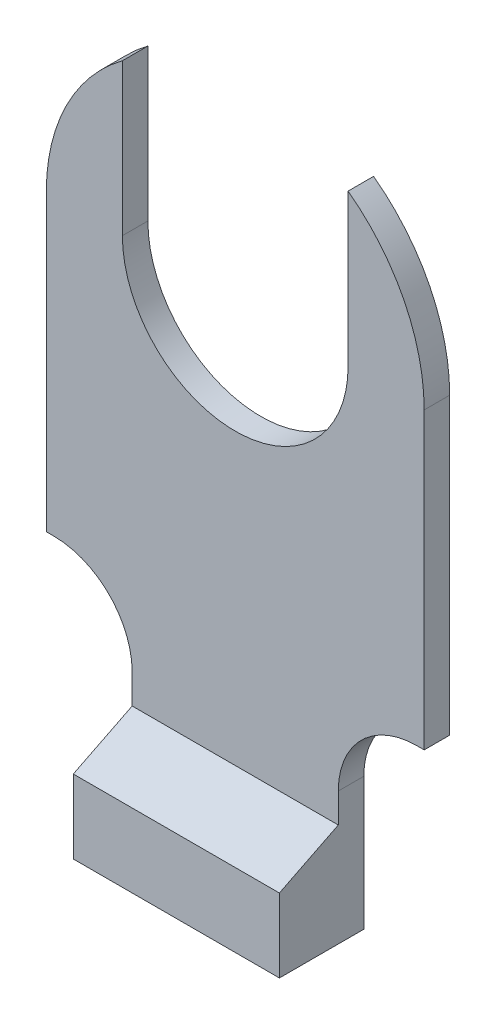
ISO-10303-21;
HEADER;
FILE_DESCRIPTION(('STEP AP214'),'2;1');
FILE_NAME('part.step','',(''),(''),'','','');
FILE_SCHEMA(('AUTOMOTIVE_DESIGN { 1 0 10303 214 1 1 1 1 }'));
ENDSEC;
DATA;
#1=APPLICATION_CONTEXT('core data for automotive mechanical design processes');
#2=APPLICATION_PROTOCOL_DEFINITION('international standard','automotive_design',2000,#1);
#3=PRODUCT_CONTEXT('',#1,'mechanical');
#4=PRODUCT('Part','Part','',(#3));
#5=PRODUCT_RELATED_PRODUCT_CATEGORY('part','',(#4));
#6=PRODUCT_DEFINITION_FORMATION('','',#4);
#7=PRODUCT_DEFINITION_CONTEXT('part definition',#1,'design');
#8=PRODUCT_DEFINITION('design','',#6,#7);
#9=PRODUCT_DEFINITION_SHAPE('','',#8);
#10=(LENGTH_UNIT() NAMED_UNIT(*) SI_UNIT(.MILLI.,.METRE.));
#11=(NAMED_UNIT(*) PLANE_ANGLE_UNIT() SI_UNIT($,.RADIAN.));
#12=(NAMED_UNIT(*) SI_UNIT($,.STERADIAN.) SOLID_ANGLE_UNIT());
#13=UNCERTAINTY_MEASURE_WITH_UNIT(LENGTH_MEASURE(1.E-05),#10,'distance_accuracy_value','');
#14=(GEOMETRIC_REPRESENTATION_CONTEXT(3) GLOBAL_UNCERTAINTY_ASSIGNED_CONTEXT((#13)) GLOBAL_UNIT_ASSIGNED_CONTEXT((#10,
#11,#12)) REPRESENTATION_CONTEXT('',''));
#15=CARTESIAN_POINT('',(0.,0.,0.));
#16=DIRECTION('',(0.,0.,1.));
#17=DIRECTION('',(1.,0.,0.));
#18=AXIS2_PLACEMENT_3D('',#15,#16,#17);
#19=CARTESIAN_POINT('',(0.,0.,1.04));
#20=DIRECTION('',(0.,0.,-1.));
#21=DIRECTION('',(-1.,0.,0.));
#22=AXIS2_PLACEMENT_3D('',#19,#20,#21);
#23=CYLINDRICAL_SURFACE('',#22,4.6);
#24=CARTESIAN_POINT('',(0.,0.,0.));
#25=DIRECTION('',(0.,0.,-1.));
#26=DIRECTION('',(1.,0.,0.));
#27=AXIS2_PLACEMENT_3D('',#24,#25,#26);
#28=CIRCLE('',#27,4.6);
#29=CARTESIAN_POINT('',(4.6,0.,0.));
#30=VERTEX_POINT('',#29);
#31=CARTESIAN_POINT('',(-4.6,0.,0.));
#32=VERTEX_POINT('',#31);
#33=EDGE_CURVE('E203',#30,#32,#28,.T.);
#34=ORIENTED_EDGE('',*,*,#33,.T.);
#35=DIRECTION('',(0.,0.,-1.));
#36=VECTOR('',#35,1.);
#37=CARTESIAN_POINT('',(-4.6,0.,1.04));
#38=LINE('',#37,#36);
#39=CARTESIAN_POINT('',(-4.6,0.,1.04));
#40=VERTEX_POINT('',#39);
#41=EDGE_CURVE('E263',#40,#32,#38,.T.);
#42=ORIENTED_EDGE('',*,*,#41,.F.);
#43=CARTESIAN_POINT('',(0.,0.,1.04));
#44=DIRECTION('',(0.,0.,-1.));
#45=DIRECTION('',(1.,0.,0.));
#46=AXIS2_PLACEMENT_3D('',#43,#44,#45);
#47=CIRCLE('',#46,4.6);
#48=CARTESIAN_POINT('',(4.6,0.,1.04));
#49=VERTEX_POINT('',#48);
#50=EDGE_CURVE('E215',#49,#40,#47,.T.);
#51=ORIENTED_EDGE('',*,*,#50,.F.);
#52=DIRECTION('',(0.,0.,-1.));
#53=VECTOR('',#52,1.);
#54=CARTESIAN_POINT('',(4.6,0.,1.04));
#55=LINE('',#54,#53);
#56=EDGE_CURVE('E232',#49,#30,#55,.T.);
#57=ORIENTED_EDGE('',*,*,#56,.T.);
#58=EDGE_LOOP('',(#34,#42,#51,#57));
#59=FACE_BOUND('',#58,.T.);
#60=ADVANCED_FACE('F34',(#59),#23,.F.);
#61=CARTESIAN_POINT('',(-4.6,0.,1.04));
#62=DIRECTION('',(-1.,0.,0.));
#63=DIRECTION('',(0.,0.,1.));
#64=AXIS2_PLACEMENT_3D('',#61,#62,#63);
#65=PLANE('',#64);
#66=DIRECTION('',(0.,1.,0.));
#67=VECTOR('',#66,1.);
#68=CARTESIAN_POINT('',(-4.6,0.,0.));
#69=LINE('',#68,#67);
#70=CARTESIAN_POINT('',(-4.6,6.17494939250517,0.));
#71=VERTEX_POINT('',#70);
#72=EDGE_CURVE('E235',#32,#71,#69,.T.);
#73=ORIENTED_EDGE('',*,*,#72,.T.);
#74=DIRECTION('',(0.,0.,-1.));
#75=VECTOR('',#74,1.);
#76=CARTESIAN_POINT('',(-4.6,6.17494939250517,1.04));
#77=LINE('',#76,#75);
#78=CARTESIAN_POINT('',(-4.6,6.17494939250517,1.04));
#79=VERTEX_POINT('',#78);
#80=EDGE_CURVE('E260',#79,#71,#77,.T.);
#81=ORIENTED_EDGE('',*,*,#80,.F.);
#82=DIRECTION('',(0.,1.,0.));
#83=VECTOR('',#82,1.);
#84=CARTESIAN_POINT('',(-4.6,0.,1.04));
#85=LINE('',#84,#83);
#86=EDGE_CURVE('E218',#40,#79,#85,.T.);
#87=ORIENTED_EDGE('',*,*,#86,.F.);
#88=ORIENTED_EDGE('',*,*,#41,.T.);
#89=EDGE_LOOP('',(#73,#81,#87,#88));
#90=FACE_BOUND('',#89,.T.);
#91=ADVANCED_FACE('F268',(#90),#65,.F.);
#92=CARTESIAN_POINT('',(0.,0.,1.04));
#93=DIRECTION('',(0.,0.,-1.));
#94=DIRECTION('',(-1.,0.,0.));
#95=AXIS2_PLACEMENT_3D('',#92,#93,#94);
#96=CYLINDRICAL_SURFACE('',#95,7.7);
#97=CARTESIAN_POINT('',(0.,0.,0.));
#98=DIRECTION('',(0.,0.,1.));
#99=DIRECTION('',(1.,0.,0.));
#100=AXIS2_PLACEMENT_3D('',#97,#98,#99);
#101=CIRCLE('',#100,7.7);
#102=CARTESIAN_POINT('',(-7.7,0.,0.));
#103=VERTEX_POINT('',#102);
#104=EDGE_CURVE('E237',#71,#103,#101,.T.);
#105=ORIENTED_EDGE('',*,*,#104,.T.);
#106=DIRECTION('',(0.,0.,-1.));
#107=VECTOR('',#106,1.);
#108=CARTESIAN_POINT('',(-7.7,0.,1.04));
#109=LINE('',#108,#107);
#110=CARTESIAN_POINT('',(-7.7,0.,1.04));
#111=VERTEX_POINT('',#110);
#112=EDGE_CURVE('E257',#111,#103,#109,.T.);
#113=ORIENTED_EDGE('',*,*,#112,.F.);
#114=CARTESIAN_POINT('',(0.,0.,1.04));
#115=DIRECTION('',(0.,0.,1.));
#116=DIRECTION('',(1.,0.,0.));
#117=AXIS2_PLACEMENT_3D('',#114,#115,#116);
#118=CIRCLE('',#117,7.7);
#119=EDGE_CURVE('E221',#79,#111,#118,.T.);
#120=ORIENTED_EDGE('',*,*,#119,.F.);
#121=ORIENTED_EDGE('',*,*,#80,.T.);
#122=EDGE_LOOP('',(#105,#113,#120,#121));
#123=FACE_BOUND('',#122,.T.);
#124=ADVANCED_FACE('F284',(#123),#96,.T.);
#125=CARTESIAN_POINT('',(-7.7,-20.6,1.04));
#126=DIRECTION('',(1.,0.,0.));
#127=DIRECTION('',(0.,1.,0.));
#128=AXIS2_PLACEMENT_3D('',#125,#126,#127);
#129=PLANE('',#128);
#130=DIRECTION('',(0.,-1.,0.));
#131=VECTOR('',#130,1.);
#132=CARTESIAN_POINT('',(-7.7,-20.6,0.));
#133=LINE('',#132,#131);
#134=CARTESIAN_POINT('',(-7.7,-12.,0.));
#135=VERTEX_POINT('',#134);
#136=EDGE_CURVE('E239',#103,#135,#133,.T.);
#137=ORIENTED_EDGE('',*,*,#136,.T.);
#138=DIRECTION('',(0.,0.,1.));
#139=VECTOR('',#138,1.);
#140=CARTESIAN_POINT('',(-7.7,-12.,-9.28493403315286));
#141=LINE('',#140,#139);
#142=CARTESIAN_POINT('',(-7.7,-12.,1.04));
#143=VERTEX_POINT('',#142);
#144=EDGE_CURVE('E198',#135,#143,#141,.T.);
#145=ORIENTED_EDGE('',*,*,#144,.T.);
#146=DIRECTION('',(0.,-1.,0.));
#147=VECTOR('',#146,1.);
#148=CARTESIAN_POINT('',(-7.7,-20.6,1.04));
#149=LINE('',#148,#147);
#150=EDGE_CURVE('E223',#111,#143,#149,.T.);
#151=ORIENTED_EDGE('',*,*,#150,.F.);
#152=ORIENTED_EDGE('',*,*,#112,.T.);
#153=EDGE_LOOP('',(#137,#145,#151,#152));
#154=FACE_BOUND('',#153,.T.);
#155=ADVANCED_FACE('F288',(#154),#129,.F.);
#156=CARTESIAN_POINT('',(7.7,-20.6,1.04));
#157=DIRECTION('',(0.,1.,0.));
#158=DIRECTION('',(0.,0.,1.));
#159=AXIS2_PLACEMENT_3D('',#156,#157,#158);
#160=PLANE('',#159);
#161=DIRECTION('',(1.,0.,0.));
#162=VECTOR('',#161,1.);
#163=CARTESIAN_POINT('',(7.7,-20.6,0.));
#164=LINE('',#163,#162);
#165=CARTESIAN_POINT('',(-4.2,-20.6,0.));
#166=VERTEX_POINT('',#165);
#167=CARTESIAN_POINT('',(4.2,-20.6,0.));
#168=VERTEX_POINT('',#167);
#169=EDGE_CURVE('E242',#166,#168,#164,.T.);
#170=ORIENTED_EDGE('',*,*,#169,.T.);
#171=DIRECTION('',(0.,0.,1.));
#172=VECTOR('',#171,1.);
#173=CARTESIAN_POINT('',(4.2,-20.6,-9.28493403315286));
#174=LINE('',#173,#172);
#175=CARTESIAN_POINT('',(4.2,-20.6,3.44));
#176=VERTEX_POINT('',#175);
#177=EDGE_CURVE('E160',#168,#176,#174,.T.);
#178=ORIENTED_EDGE('',*,*,#177,.T.);
#179=DIRECTION('',(1.,0.,0.));
#180=VECTOR('',#179,1.);
#181=CARTESIAN_POINT('',(-4.2,-20.6,3.44));
#182=LINE('',#181,#180);
#183=CARTESIAN_POINT('',(-4.2,-20.6,3.44));
#184=VERTEX_POINT('',#183);
#185=EDGE_CURVE('E158',#184,#176,#182,.T.);
#186=ORIENTED_EDGE('',*,*,#185,.F.);
#187=DIRECTION('',(0.,0.,1.));
#188=VECTOR('',#187,1.);
#189=CARTESIAN_POINT('',(-4.2,-20.6,-9.28493403315286));
#190=LINE('',#189,#188);
#191=EDGE_CURVE('E144',#166,#184,#190,.T.);
#192=ORIENTED_EDGE('',*,*,#191,.F.);
#193=EDGE_LOOP('',(#170,#178,#186,#192));
#194=FACE_BOUND('',#193,.T.);
#195=ADVANCED_FACE('F159',(#194),#160,.F.);
#196=CARTESIAN_POINT('',(7.7,-20.6,1.04));
#197=DIRECTION('',(-1.,0.,0.));
#198=DIRECTION('',(0.,-1.,0.));
#199=AXIS2_PLACEMENT_3D('',#196,#197,#198);
#200=PLANE('',#199);
#201=DIRECTION('',(0.,1.,0.));
#202=VECTOR('',#201,1.);
#203=CARTESIAN_POINT('',(7.7,-20.6,1.04));
#204=LINE('',#203,#202);
#205=CARTESIAN_POINT('',(7.7,-12.,1.04));
#206=VERTEX_POINT('',#205);
#207=CARTESIAN_POINT('',(7.7,0.,1.04));
#208=VERTEX_POINT('',#207);
#209=EDGE_CURVE('E226',#206,#208,#204,.T.);
#210=ORIENTED_EDGE('',*,*,#209,.F.);
#211=DIRECTION('',(0.,0.,1.));
#212=VECTOR('',#211,1.);
#213=CARTESIAN_POINT('',(7.7,-12.,-9.28493403315286));
#214=LINE('',#213,#212);
#215=CARTESIAN_POINT('',(7.7,-12.,0.));
#216=VERTEX_POINT('',#215);
#217=EDGE_CURVE('E190',#216,#206,#214,.T.);
#218=ORIENTED_EDGE('',*,*,#217,.F.);
#219=DIRECTION('',(0.,1.,0.));
#220=VECTOR('',#219,1.);
#221=CARTESIAN_POINT('',(7.7,-20.6,0.));
#222=LINE('',#221,#220);
#223=CARTESIAN_POINT('',(7.7,0.,0.));
#224=VERTEX_POINT('',#223);
#225=EDGE_CURVE('E244',#216,#224,#222,.T.);
#226=ORIENTED_EDGE('',*,*,#225,.T.);
#227=DIRECTION('',(0.,0.,-1.));
#228=VECTOR('',#227,1.);
#229=CARTESIAN_POINT('',(7.7,0.,1.04));
#230=LINE('',#229,#228);
#231=EDGE_CURVE('E254',#208,#224,#230,.T.);
#232=ORIENTED_EDGE('',*,*,#231,.F.);
#233=EDGE_LOOP('',(#210,#218,#226,#232));
#234=FACE_BOUND('',#233,.T.);
#235=ADVANCED_FACE('F305',(#234),#200,.F.);
#236=CARTESIAN_POINT('',(0.,0.,1.04));
#237=DIRECTION('',(0.,0.,-1.));
#238=DIRECTION('',(-1.,0.,0.));
#239=AXIS2_PLACEMENT_3D('',#236,#237,#238);
#240=CYLINDRICAL_SURFACE('',#239,7.7);
#241=CARTESIAN_POINT('',(0.,0.,0.));
#242=DIRECTION('',(0.,0.,1.));
#243=DIRECTION('',(1.,0.,0.));
#244=AXIS2_PLACEMENT_3D('',#241,#242,#243);
#245=CIRCLE('',#244,7.7);
#246=CARTESIAN_POINT('',(4.6,6.17494939250517,0.));
#247=VERTEX_POINT('',#246);
#248=EDGE_CURVE('E246',#224,#247,#245,.T.);
#249=ORIENTED_EDGE('',*,*,#248,.T.);
#250=DIRECTION('',(0.,0.,-1.));
#251=VECTOR('',#250,1.);
#252=CARTESIAN_POINT('',(4.6,6.17494939250517,1.04));
#253=LINE('',#252,#251);
#254=CARTESIAN_POINT('',(4.6,6.17494939250517,1.04));
#255=VERTEX_POINT('',#254);
#256=EDGE_CURVE('E251',#255,#247,#253,.T.);
#257=ORIENTED_EDGE('',*,*,#256,.F.);
#258=CARTESIAN_POINT('',(0.,0.,1.04));
#259=DIRECTION('',(0.,0.,1.));
#260=DIRECTION('',(1.,0.,0.));
#261=AXIS2_PLACEMENT_3D('',#258,#259,#260);
#262=CIRCLE('',#261,7.7);
#263=EDGE_CURVE('E228',#208,#255,#262,.T.);
#264=ORIENTED_EDGE('',*,*,#263,.F.);
#265=ORIENTED_EDGE('',*,*,#231,.T.);
#266=EDGE_LOOP('',(#249,#257,#264,#265));
#267=FACE_BOUND('',#266,.T.);
#268=ADVANCED_FACE('F298',(#267),#240,.T.);
#269=CARTESIAN_POINT('',(4.6,0.,1.04));
#270=DIRECTION('',(1.,0.,0.));
#271=DIRECTION('',(0.,0.,-1.));
#272=AXIS2_PLACEMENT_3D('',#269,#270,#271);
#273=PLANE('',#272);
#274=DIRECTION('',(0.,-1.,0.));
#275=VECTOR('',#274,1.);
#276=CARTESIAN_POINT('',(4.6,0.,0.));
#277=LINE('',#276,#275);
#278=EDGE_CURVE('E219',#247,#30,#277,.T.);
#279=ORIENTED_EDGE('',*,*,#278,.T.);
#280=ORIENTED_EDGE('',*,*,#56,.F.);
#281=DIRECTION('',(0.,-1.,0.));
#282=VECTOR('',#281,1.);
#283=CARTESIAN_POINT('',(4.6,0.,1.04));
#284=LINE('',#283,#282);
#285=EDGE_CURVE('E230',#255,#49,#284,.T.);
#286=ORIENTED_EDGE('',*,*,#285,.F.);
#287=ORIENTED_EDGE('',*,*,#256,.T.);
#288=EDGE_LOOP('',(#279,#280,#286,#287));
#289=FACE_BOUND('',#288,.T.);
#290=ADVANCED_FACE('F296',(#289),#273,.F.);
#291=CARTESIAN_POINT('',(0.,0.,1.04));
#292=DIRECTION('',(0.,0.,1.));
#293=DIRECTION('',(1.,0.,0.));
#294=AXIS2_PLACEMENT_3D('',#291,#292,#293);
#295=PLANE('',#294);
#296=DIRECTION('',(0.,1.,0.));
#297=VECTOR('',#296,1.);
#298=CARTESIAN_POINT('',(-4.2,-20.6,1.04));
#299=LINE('',#298,#297);
#300=CARTESIAN_POINT('',(-4.2,-16.4,1.04));
#301=VERTEX_POINT('',#300);
#302=CARTESIAN_POINT('',(-4.2,-15.2,1.04));
#303=VERTEX_POINT('',#302);
#304=EDGE_CURVE('E195',#301,#303,#299,.T.);
#305=ORIENTED_EDGE('',*,*,#304,.F.);
#306=DIRECTION('',(1.,0.,0.));
#307=VECTOR('',#306,1.);
#308=CARTESIAN_POINT('',(0.,-16.4,1.04));
#309=LINE('',#308,#307);
#310=CARTESIAN_POINT('',(4.2,-16.4,1.04));
#311=VERTEX_POINT('',#310);
#312=EDGE_CURVE('E55',#301,#311,#309,.T.);
#313=ORIENTED_EDGE('',*,*,#312,.T.);
#314=DIRECTION('',(0.,-1.,0.));
#315=VECTOR('',#314,1.);
#316=CARTESIAN_POINT('',(4.2,-20.6,1.04));
#317=LINE('',#316,#315);
#318=CARTESIAN_POINT('',(4.2,-15.2,1.04));
#319=VERTEX_POINT('',#318);
#320=EDGE_CURVE('E183',#319,#311,#317,.T.);
#321=ORIENTED_EDGE('',*,*,#320,.F.);
#322=CARTESIAN_POINT('',(7.4,-15.2,1.04));
#323=DIRECTION('',(0.,0.,1.));
#324=DIRECTION('',(-1.,0.,0.));
#325=AXIS2_PLACEMENT_3D('',#322,#323,#324);
#326=CIRCLE('',#325,3.2);
#327=CARTESIAN_POINT('',(7.4,-12.,1.04));
#328=VERTEX_POINT('',#327);
#329=EDGE_CURVE('E174',#328,#319,#326,.T.);
#330=ORIENTED_EDGE('',*,*,#329,.F.);
#331=DIRECTION('',(-1.,0.,0.));
#332=VECTOR('',#331,1.);
#333=CARTESIAN_POINT('',(7.7,-12.,1.04));
#334=LINE('',#333,#332);
#335=EDGE_CURVE('E185',#206,#328,#334,.T.);
#336=ORIENTED_EDGE('',*,*,#335,.F.);
#337=ORIENTED_EDGE('',*,*,#209,.T.);
#338=ORIENTED_EDGE('',*,*,#263,.T.);
#339=ORIENTED_EDGE('',*,*,#285,.T.);
#340=ORIENTED_EDGE('',*,*,#50,.T.);
#341=ORIENTED_EDGE('',*,*,#86,.T.);
#342=ORIENTED_EDGE('',*,*,#119,.T.);
#343=ORIENTED_EDGE('',*,*,#150,.T.);
#344=DIRECTION('',(-1.,0.,0.));
#345=VECTOR('',#344,1.);
#346=CARTESIAN_POINT('',(-7.7,-12.,1.04));
#347=LINE('',#346,#345);
#348=CARTESIAN_POINT('',(-7.4,-12.,1.04));
#349=VERTEX_POINT('',#348);
#350=EDGE_CURVE('E155',#349,#143,#347,.T.);
#351=ORIENTED_EDGE('',*,*,#350,.F.);
#352=CARTESIAN_POINT('',(-7.4,-15.2,1.04));
#353=DIRECTION('',(0.,0.,1.));
#354=DIRECTION('',(1.,0.,0.));
#355=AXIS2_PLACEMENT_3D('',#352,#353,#354);
#356=CIRCLE('',#355,3.2);
#357=EDGE_CURVE('E205',#303,#349,#356,.T.);
#358=ORIENTED_EDGE('',*,*,#357,.F.);
#359=EDGE_LOOP('',(#305,#313,#321,#330,#336,#337,#338,#339,#340,#341,#342,#343,#351,#358));
#360=FACE_BOUND('',#359,.T.);
#361=ADVANCED_FACE('F290',(#360),#295,.T.);
#362=CARTESIAN_POINT('',(0.,0.,0.));
#363=DIRECTION('',(0.,0.,1.));
#364=DIRECTION('',(1.,0.,0.));
#365=AXIS2_PLACEMENT_3D('',#362,#363,#364);
#366=PLANE('',#365);
#367=ORIENTED_EDGE('',*,*,#225,.F.);
#368=DIRECTION('',(1.,0.,0.));
#369=VECTOR('',#368,1.);
#370=CARTESIAN_POINT('',(7.7,-12.,0.));
#371=LINE('',#370,#369);
#372=CARTESIAN_POINT('',(7.4,-12.,0.));
#373=VERTEX_POINT('',#372);
#374=EDGE_CURVE('E175',#373,#216,#371,.T.);
#375=ORIENTED_EDGE('',*,*,#374,.F.);
#376=CARTESIAN_POINT('',(7.4,-15.2,0.));
#377=DIRECTION('',(0.,0.,1.));
#378=DIRECTION('',(1.,0.,0.));
#379=AXIS2_PLACEMENT_3D('',#376,#377,#378);
#380=CIRCLE('',#379,3.2);
#381=CARTESIAN_POINT('',(4.2,-15.2,0.));
#382=VERTEX_POINT('',#381);
#383=EDGE_CURVE('E177',#382,#373,#380,.F.);
#384=ORIENTED_EDGE('',*,*,#383,.F.);
#385=DIRECTION('',(0.,1.,0.));
#386=VECTOR('',#385,1.);
#387=CARTESIAN_POINT('',(4.2,-20.6,0.));
#388=LINE('',#387,#386);
#389=EDGE_CURVE('E180',#168,#382,#388,.T.);
#390=ORIENTED_EDGE('',*,*,#389,.F.);
#391=ORIENTED_EDGE('',*,*,#169,.F.);
#392=DIRECTION('',(0.,-1.,0.));
#393=VECTOR('',#392,1.);
#394=CARTESIAN_POINT('',(-4.2,-20.6,0.));
#395=LINE('',#394,#393);
#396=CARTESIAN_POINT('',(-4.2,-15.2,0.));
#397=VERTEX_POINT('',#396);
#398=EDGE_CURVE('E150',#397,#166,#395,.T.);
#399=ORIENTED_EDGE('',*,*,#398,.F.);
#400=CARTESIAN_POINT('',(-7.4,-15.2,0.));
#401=DIRECTION('',(0.,0.,1.));
#402=DIRECTION('',(1.,0.,0.));
#403=AXIS2_PLACEMENT_3D('',#400,#401,#402);
#404=CIRCLE('',#403,3.2);
#405=CARTESIAN_POINT('',(-7.4,-12.,0.));
#406=VERTEX_POINT('',#405);
#407=EDGE_CURVE('E197',#406,#397,#404,.F.);
#408=ORIENTED_EDGE('',*,*,#407,.F.);
#409=DIRECTION('',(1.,0.,0.));
#410=VECTOR('',#409,1.);
#411=CARTESIAN_POINT('',(-7.7,-12.,0.));
#412=LINE('',#411,#410);
#413=EDGE_CURVE('E201',#135,#406,#412,.T.);
#414=ORIENTED_EDGE('',*,*,#413,.F.);
#415=ORIENTED_EDGE('',*,*,#136,.F.);
#416=ORIENTED_EDGE('',*,*,#104,.F.);
#417=ORIENTED_EDGE('',*,*,#72,.F.);
#418=ORIENTED_EDGE('',*,*,#33,.F.);
#419=ORIENTED_EDGE('',*,*,#278,.F.);
#420=ORIENTED_EDGE('',*,*,#248,.F.);
#421=EDGE_LOOP('',(#367,#375,#384,#390,#391,#399,#408,#414,#415,#416,#417,#418,#419,#420));
#422=FACE_BOUND('',#421,.T.);
#423=ADVANCED_FACE('F277',(#422),#366,.F.);
#424=CARTESIAN_POINT('',(-7.7,-12.,-9.28493403315286));
#425=DIRECTION('',(0.,1.,0.));
#426=DIRECTION('',(-1.,0.,0.));
#427=AXIS2_PLACEMENT_3D('',#424,#425,#426);
#428=PLANE('',#427);
#429=ORIENTED_EDGE('',*,*,#413,.T.);
#430=DIRECTION('',(0.,0.,1.));
#431=VECTOR('',#430,1.);
#432=CARTESIAN_POINT('',(-7.4,-12.,-9.28493403315286));
#433=LINE('',#432,#431);
#434=EDGE_CURVE('E211',#406,#349,#433,.T.);
#435=ORIENTED_EDGE('',*,*,#434,.T.);
#436=ORIENTED_EDGE('',*,*,#350,.T.);
#437=ORIENTED_EDGE('',*,*,#144,.F.);
#438=EDGE_LOOP('',(#429,#435,#436,#437));
#439=FACE_BOUND('',#438,.T.);
#440=ADVANCED_FACE('F344',(#439),#428,.F.);
#441=CARTESIAN_POINT('',(-7.4,-15.2,-9.28493403315286));
#442=DIRECTION('',(0.,0.,1.));
#443=DIRECTION('',(1.,0.,0.));
#444=AXIS2_PLACEMENT_3D('',#441,#442,#443);
#445=CYLINDRICAL_SURFACE('',#444,3.2);
#446=ORIENTED_EDGE('',*,*,#407,.T.);
#447=DIRECTION('',(0.,0.,1.));
#448=VECTOR('',#447,1.);
#449=CARTESIAN_POINT('',(-4.2,-15.2,-9.28493403315286));
#450=LINE('',#449,#448);
#451=EDGE_CURVE('E154',#397,#303,#450,.T.);
#452=ORIENTED_EDGE('',*,*,#451,.T.);
#453=ORIENTED_EDGE('',*,*,#357,.T.);
#454=ORIENTED_EDGE('',*,*,#434,.F.);
#455=EDGE_LOOP('',(#446,#452,#453,#454));
#456=FACE_BOUND('',#455,.T.);
#457=ADVANCED_FACE('F349',(#456),#445,.F.);
#458=CARTESIAN_POINT('',(-4.2,-20.6,-9.28493403315286));
#459=DIRECTION('',(1.,0.,0.));
#460=DIRECTION('',(0.,0.,-1.));
#461=AXIS2_PLACEMENT_3D('',#458,#459,#460);
#462=PLANE('',#461);
#463=ORIENTED_EDGE('',*,*,#398,.T.);
#464=ORIENTED_EDGE('',*,*,#191,.T.);
#465=DIRECTION('',(0.,-1.,0.));
#466=VECTOR('',#465,1.);
#467=CARTESIAN_POINT('',(-4.2,-20.6,3.44));
#468=LINE('',#467,#466);
#469=CARTESIAN_POINT('',(-4.2,-17.6,3.44));
#470=VERTEX_POINT('',#469);
#471=EDGE_CURVE('E148',#470,#184,#468,.T.);
#472=ORIENTED_EDGE('',*,*,#471,.F.);
#473=DIRECTION('',(0.,0.447213595499958,-0.894427190999916));
#474=VECTOR('',#473,1.);
#475=CARTESIAN_POINT('',(-4.2,-13.1100263867389,-5.53994722652229));
#476=LINE('',#475,#474);
#477=EDGE_CURVE('E42',#470,#301,#476,.T.);
#478=ORIENTED_EDGE('',*,*,#477,.T.);
#479=ORIENTED_EDGE('',*,*,#304,.T.);
#480=ORIENTED_EDGE('',*,*,#451,.F.);
#481=EDGE_LOOP('',(#463,#464,#472,#478,#479,#480));
#482=FACE_BOUND('',#481,.T.);
#483=ADVANCED_FACE('F146',(#482),#462,.F.);
#484=CARTESIAN_POINT('',(7.4,-15.2,-9.28493403315286));
#485=DIRECTION('',(0.,0.,1.));
#486=DIRECTION('',(1.,0.,0.));
#487=AXIS2_PLACEMENT_3D('',#484,#485,#486);
#488=CYLINDRICAL_SURFACE('',#487,3.2);
#489=ORIENTED_EDGE('',*,*,#383,.T.);
#490=DIRECTION('',(0.,0.,1.));
#491=VECTOR('',#490,1.);
#492=CARTESIAN_POINT('',(7.4,-12.,-9.28493403315286));
#493=LINE('',#492,#491);
#494=EDGE_CURVE('E178',#373,#328,#493,.T.);
#495=ORIENTED_EDGE('',*,*,#494,.T.);
#496=ORIENTED_EDGE('',*,*,#329,.T.);
#497=DIRECTION('',(0.,0.,1.));
#498=VECTOR('',#497,1.);
#499=CARTESIAN_POINT('',(4.2,-15.2,-9.28493403315286));
#500=LINE('',#499,#498);
#501=EDGE_CURVE('E188',#382,#319,#500,.T.);
#502=ORIENTED_EDGE('',*,*,#501,.F.);
#503=EDGE_LOOP('',(#489,#495,#496,#502));
#504=FACE_BOUND('',#503,.T.);
#505=ADVANCED_FACE('F313',(#504),#488,.F.);
#506=CARTESIAN_POINT('',(7.7,-12.,-9.28493403315286));
#507=DIRECTION('',(0.,1.,0.));
#508=DIRECTION('',(-1.,0.,0.));
#509=AXIS2_PLACEMENT_3D('',#506,#507,#508);
#510=PLANE('',#509);
#511=ORIENTED_EDGE('',*,*,#374,.T.);
#512=ORIENTED_EDGE('',*,*,#217,.T.);
#513=ORIENTED_EDGE('',*,*,#335,.T.);
#514=ORIENTED_EDGE('',*,*,#494,.F.);
#515=EDGE_LOOP('',(#511,#512,#513,#514));
#516=FACE_BOUND('',#515,.T.);
#517=ADVANCED_FACE('F308',(#516),#510,.F.);
#518=CARTESIAN_POINT('',(4.2,-20.6,-9.28493403315286));
#519=DIRECTION('',(-1.,0.,0.));
#520=DIRECTION('',(0.,0.,1.));
#521=AXIS2_PLACEMENT_3D('',#518,#519,#520);
#522=PLANE('',#521);
#523=ORIENTED_EDGE('',*,*,#389,.T.);
#524=ORIENTED_EDGE('',*,*,#501,.T.);
#525=ORIENTED_EDGE('',*,*,#320,.T.);
#526=DIRECTION('',(0.,-0.447213595499959,0.894427190999916));
#527=VECTOR('',#526,1.);
#528=CARTESIAN_POINT('',(4.2,-13.1100263867389,-5.53994722652229));
#529=LINE('',#528,#527);
#530=CARTESIAN_POINT('',(4.2,-17.6,3.44));
#531=VERTEX_POINT('',#530);
#532=EDGE_CURVE('E11',#311,#531,#529,.T.);
#533=ORIENTED_EDGE('',*,*,#532,.T.);
#534=DIRECTION('',(0.,1.,0.));
#535=VECTOR('',#534,1.);
#536=CARTESIAN_POINT('',(4.2,-20.6,3.44));
#537=LINE('',#536,#535);
#538=EDGE_CURVE('E164',#176,#531,#537,.T.);
#539=ORIENTED_EDGE('',*,*,#538,.F.);
#540=ORIENTED_EDGE('',*,*,#177,.F.);
#541=EDGE_LOOP('',(#523,#524,#525,#533,#539,#540));
#542=FACE_BOUND('',#541,.T.);
#543=ADVANCED_FACE('F316',(#542),#522,.F.);
#544=CARTESIAN_POINT('',(0.,0.,3.44));
#545=DIRECTION('',(0.,0.,-1.));
#546=DIRECTION('',(-1.,0.,0.));
#547=AXIS2_PLACEMENT_3D('',#544,#545,#546);
#548=PLANE('',#547);
#549=ORIENTED_EDGE('',*,*,#471,.T.);
#550=ORIENTED_EDGE('',*,*,#185,.T.);
#551=ORIENTED_EDGE('',*,*,#538,.T.);
#552=DIRECTION('',(-1.,0.,0.));
#553=VECTOR('',#552,1.);
#554=CARTESIAN_POINT('',(-4.2,-17.6,3.44));
#555=LINE('',#554,#553);
#556=EDGE_CURVE('E169',#531,#470,#555,.T.);
#557=ORIENTED_EDGE('',*,*,#556,.T.);
#558=EDGE_LOOP('',(#549,#550,#551,#557));
#559=FACE_BOUND('',#558,.T.);
#560=ADVANCED_FACE('F167',(#559),#548,.F.);
#561=CARTESIAN_POINT('',(-4.2,-17.6,3.43999999999998));
#562=DIRECTION('',(0.,-0.894427190999916,-0.447213595499958));
#563=DIRECTION('',(-1.,0.,0.));
#564=AXIS2_PLACEMENT_3D('',#561,#562,#563);
#565=PLANE('',#564);
#566=ORIENTED_EDGE('',*,*,#532,.F.);
#567=ORIENTED_EDGE('',*,*,#312,.F.);
#568=ORIENTED_EDGE('',*,*,#477,.F.);
#569=ORIENTED_EDGE('',*,*,#556,.F.);
#570=EDGE_LOOP('',(#566,#567,#568,#569));
#571=FACE_BOUND('',#570,.T.);
#572=ADVANCED_FACE('F36',(#571),#565,.F.);
#573=CLOSED_SHELL('',(#60,#91,#124,#155,#195,#235,#268,#290,#361,#423,#440,#457,#483,#505,#517,
#543,#560,#572));
#574=MANIFOLD_SOLID_BREP('B2',#573);
#575=ADVANCED_BREP_SHAPE_REPRESENTATION('',(#18,#574),#14);
#576=SHAPE_DEFINITION_REPRESENTATION(#9,#575);
ENDSEC;
END-ISO-10303-21;
